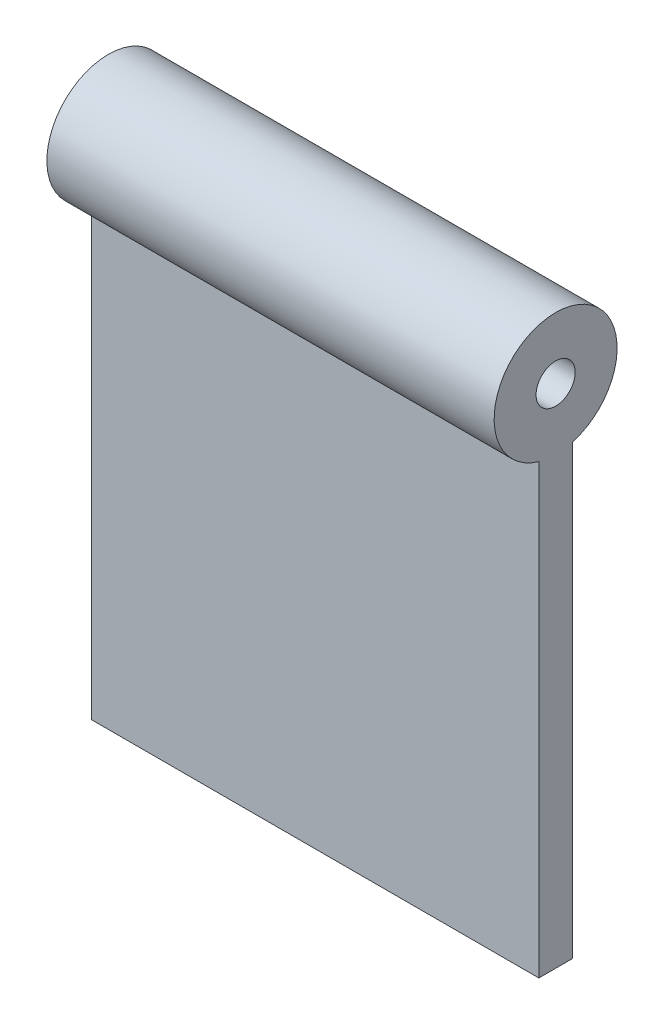
ISO-10303-21;
HEADER;
FILE_DESCRIPTION(('STEP AP214'),'2;1');
FILE_NAME('part.step','',(''),(''),'','','');
FILE_SCHEMA(('AUTOMOTIVE_DESIGN { 1 0 10303 214 1 1 1 1 }'));
ENDSEC;
DATA;
#1=APPLICATION_CONTEXT('core data for automotive mechanical design processes');
#2=APPLICATION_PROTOCOL_DEFINITION('international standard','automotive_design',2000,#1);
#3=PRODUCT_CONTEXT('',#1,'mechanical');
#4=PRODUCT('Part','Part','',(#3));
#5=PRODUCT_RELATED_PRODUCT_CATEGORY('part','',(#4));
#6=PRODUCT_DEFINITION_FORMATION('','',#4);
#7=PRODUCT_DEFINITION_CONTEXT('part definition',#1,'design');
#8=PRODUCT_DEFINITION('design','',#6,#7);
#9=PRODUCT_DEFINITION_SHAPE('','',#8);
#10=(LENGTH_UNIT() NAMED_UNIT(*) SI_UNIT(.MILLI.,.METRE.));
#11=(NAMED_UNIT(*) PLANE_ANGLE_UNIT() SI_UNIT($,.RADIAN.));
#12=(NAMED_UNIT(*) SI_UNIT($,.STERADIAN.) SOLID_ANGLE_UNIT());
#13=UNCERTAINTY_MEASURE_WITH_UNIT(LENGTH_MEASURE(1.E-05),#10,'distance_accuracy_value','');
#14=(GEOMETRIC_REPRESENTATION_CONTEXT(3) GLOBAL_UNCERTAINTY_ASSIGNED_CONTEXT((#13)) GLOBAL_UNIT_ASSIGNED_CONTEXT((#10,
#11,#12)) REPRESENTATION_CONTEXT('',''));
#15=CARTESIAN_POINT('',(0.,0.,0.));
#16=DIRECTION('',(0.,0.,1.));
#17=DIRECTION('',(1.,0.,0.));
#18=AXIS2_PLACEMENT_3D('',#15,#16,#17);
#19=CARTESIAN_POINT('',(8.,0.,0.));
#20=DIRECTION('',(1.,0.,0.));
#21=DIRECTION('',(0.,0.,-1.));
#22=AXIS2_PLACEMENT_3D('',#19,#20,#21);
#23=PLANE('',#22);
#24=CARTESIAN_POINT('',(8.,0.,0.));
#25=DIRECTION('',(1.,0.,0.));
#26=DIRECTION('',(0.,0.,-1.));
#27=AXIS2_PLACEMENT_3D('',#24,#25,#26);
#28=CIRCLE('',#27,1.1);
#29=CARTESIAN_POINT('',(8.,-1.05830052442584,-0.3));
#30=VERTEX_POINT('',#29);
#31=CARTESIAN_POINT('',(8.,-1.05830052442584,0.3));
#32=VERTEX_POINT('',#31);
#33=EDGE_CURVE('E87',#30,#32,#28,.T.);
#34=ORIENTED_EDGE('',*,*,#33,.T.);
#35=DIRECTION('',(0.,-1.,0.));
#36=VECTOR('',#35,1.);
#37=CARTESIAN_POINT('',(8.,-9.05830052442584,0.300000000000001));
#38=LINE('',#37,#36);
#39=CARTESIAN_POINT('',(8.,-9.05830052442584,0.300000000000001));
#40=VERTEX_POINT('',#39);
#41=EDGE_CURVE('E82',#32,#40,#38,.T.);
#42=ORIENTED_EDGE('',*,*,#41,.T.);
#43=DIRECTION('',(0.,0.,-1.));
#44=VECTOR('',#43,1.);
#45=CARTESIAN_POINT('',(8.,-9.05830052442584,-0.300000000000001));
#46=LINE('',#45,#44);
#47=CARTESIAN_POINT('',(8.,-9.05830052442584,-0.300000000000001));
#48=VERTEX_POINT('',#47);
#49=EDGE_CURVE('E85',#40,#48,#46,.T.);
#50=ORIENTED_EDGE('',*,*,#49,.T.);
#51=DIRECTION('',(0.,1.,0.));
#52=VECTOR('',#51,1.);
#53=CARTESIAN_POINT('',(8.,-1.05830052442584,-0.3));
#54=LINE('',#53,#52);
#55=EDGE_CURVE('E52',#48,#30,#54,.T.);
#56=ORIENTED_EDGE('',*,*,#55,.T.);
#57=EDGE_LOOP('',(#34,#42,#50,#56));
#58=FACE_BOUND('',#57,.T.);
#59=CARTESIAN_POINT('',(8.,0.,0.));
#60=DIRECTION('',(1.,0.,0.));
#61=DIRECTION('',(0.,0.,-1.));
#62=AXIS2_PLACEMENT_3D('',#59,#60,#61);
#63=CIRCLE('',#62,0.35);
#64=CARTESIAN_POINT('',(8.,0.,-0.35));
#65=VERTEX_POINT('',#64);
#66=EDGE_CURVE('E102',#65,#65,#63,.T.);
#67=ORIENTED_EDGE('',*,*,#66,.F.);
#68=EDGE_LOOP('',(#67));
#69=FACE_BOUND('',#68,.T.);
#70=ADVANCED_FACE('F35',(#58,#69),#23,.T.);
#71=CARTESIAN_POINT('',(0.,0.,0.));
#72=DIRECTION('',(1.,0.,0.));
#73=DIRECTION('',(0.,0.,-1.));
#74=AXIS2_PLACEMENT_3D('',#71,#72,#73);
#75=PLANE('',#74);
#76=CARTESIAN_POINT('',(0.,0.,0.));
#77=DIRECTION('',(1.,0.,0.));
#78=DIRECTION('',(0.,0.,-1.));
#79=AXIS2_PLACEMENT_3D('',#76,#77,#78);
#80=CIRCLE('',#79,1.1);
#81=CARTESIAN_POINT('',(0.,-1.05830052442584,-0.3));
#82=VERTEX_POINT('',#81);
#83=CARTESIAN_POINT('',(0.,-1.05830052442584,0.3));
#84=VERTEX_POINT('',#83);
#85=EDGE_CURVE('E99',#82,#84,#80,.T.);
#86=ORIENTED_EDGE('',*,*,#85,.F.);
#87=DIRECTION('',(0.,1.,0.));
#88=VECTOR('',#87,1.);
#89=CARTESIAN_POINT('',(0.,-1.05830052442584,-0.3));
#90=LINE('',#89,#88);
#91=CARTESIAN_POINT('',(0.,-9.05830052442584,-0.300000000000001));
#92=VERTEX_POINT('',#91);
#93=EDGE_CURVE('E75',#92,#82,#90,.T.);
#94=ORIENTED_EDGE('',*,*,#93,.F.);
#95=DIRECTION('',(0.,0.,-1.));
#96=VECTOR('',#95,1.);
#97=CARTESIAN_POINT('',(0.,-9.05830052442584,-0.300000000000001));
#98=LINE('',#97,#96);
#99=CARTESIAN_POINT('',(0.,-9.05830052442584,0.300000000000001));
#100=VERTEX_POINT('',#99);
#101=EDGE_CURVE('E69',#100,#92,#98,.T.);
#102=ORIENTED_EDGE('',*,*,#101,.F.);
#103=DIRECTION('',(0.,-1.,0.));
#104=VECTOR('',#103,1.);
#105=CARTESIAN_POINT('',(0.,-9.05830052442584,0.300000000000001));
#106=LINE('',#105,#104);
#107=EDGE_CURVE('E91',#84,#100,#106,.T.);
#108=ORIENTED_EDGE('',*,*,#107,.F.);
#109=EDGE_LOOP('',(#86,#94,#102,#108));
#110=FACE_BOUND('',#109,.T.);
#111=CARTESIAN_POINT('',(0.,0.,0.));
#112=DIRECTION('',(1.,0.,0.));
#113=DIRECTION('',(0.,0.,-1.));
#114=AXIS2_PLACEMENT_3D('',#111,#112,#113);
#115=CIRCLE('',#114,0.35);
#116=CARTESIAN_POINT('',(0.,0.,-0.35));
#117=VERTEX_POINT('',#116);
#118=EDGE_CURVE('E114',#117,#117,#115,.T.);
#119=ORIENTED_EDGE('',*,*,#118,.T.);
#120=EDGE_LOOP('',(#119));
#121=FACE_BOUND('',#120,.T.);
#122=ADVANCED_FACE('F110',(#110,#121),#75,.F.);
#123=CARTESIAN_POINT('',(8.,0.,0.));
#124=DIRECTION('',(-1.,0.,0.));
#125=DIRECTION('',(0.,0.,1.));
#126=AXIS2_PLACEMENT_3D('',#123,#124,#125);
#127=CYLINDRICAL_SURFACE('',#126,1.1);
#128=ORIENTED_EDGE('',*,*,#85,.T.);
#129=DIRECTION('',(-1.,0.,0.));
#130=VECTOR('',#129,1.);
#131=CARTESIAN_POINT('',(8.,-1.05830052442584,0.3));
#132=LINE('',#131,#130);
#133=EDGE_CURVE('E11',#32,#84,#132,.T.);
#134=ORIENTED_EDGE('',*,*,#133,.F.);
#135=ORIENTED_EDGE('',*,*,#33,.F.);
#136=DIRECTION('',(-1.,0.,0.));
#137=VECTOR('',#136,1.);
#138=CARTESIAN_POINT('',(8.,-1.05830052442584,-0.3));
#139=LINE('',#138,#137);
#140=EDGE_CURVE('E95',#30,#82,#139,.T.);
#141=ORIENTED_EDGE('',*,*,#140,.T.);
#142=EDGE_LOOP('',(#128,#134,#135,#141));
#143=FACE_BOUND('',#142,.T.);
#144=ADVANCED_FACE('F37',(#143),#127,.T.);
#145=CARTESIAN_POINT('',(8.,-9.05830052442584,0.300000000000001));
#146=DIRECTION('',(0.,0.,-1.));
#147=DIRECTION('',(0.,1.,0.));
#148=AXIS2_PLACEMENT_3D('',#145,#146,#147);
#149=PLANE('',#148);
#150=ORIENTED_EDGE('',*,*,#107,.T.);
#151=DIRECTION('',(-1.,0.,0.));
#152=VECTOR('',#151,1.);
#153=CARTESIAN_POINT('',(8.,-9.05830052442584,0.300000000000001));
#154=LINE('',#153,#152);
#155=EDGE_CURVE('E44',#40,#100,#154,.T.);
#156=ORIENTED_EDGE('',*,*,#155,.F.);
#157=ORIENTED_EDGE('',*,*,#41,.F.);
#158=ORIENTED_EDGE('',*,*,#133,.T.);
#159=EDGE_LOOP('',(#150,#156,#157,#158));
#160=FACE_BOUND('',#159,.T.);
#161=ADVANCED_FACE('F90',(#160),#149,.F.);
#162=CARTESIAN_POINT('',(8.,-9.05830052442584,-0.300000000000001));
#163=DIRECTION('',(0.,1.,0.));
#164=DIRECTION('',(0.,0.,1.));
#165=AXIS2_PLACEMENT_3D('',#162,#163,#164);
#166=PLANE('',#165);
#167=ORIENTED_EDGE('',*,*,#101,.T.);
#168=DIRECTION('',(-1.,0.,0.));
#169=VECTOR('',#168,1.);
#170=CARTESIAN_POINT('',(8.,-9.05830052442584,-0.300000000000001));
#171=LINE('',#170,#169);
#172=EDGE_CURVE('E92',#48,#92,#171,.T.);
#173=ORIENTED_EDGE('',*,*,#172,.F.);
#174=ORIENTED_EDGE('',*,*,#49,.F.);
#175=ORIENTED_EDGE('',*,*,#155,.T.);
#176=EDGE_LOOP('',(#167,#173,#174,#175));
#177=FACE_BOUND('',#176,.T.);
#178=ADVANCED_FACE('F93',(#177),#166,.F.);
#179=CARTESIAN_POINT('',(8.,-1.05830052442584,-0.3));
#180=DIRECTION('',(0.,0.,1.));
#181=DIRECTION('',(0.,-1.,0.));
#182=AXIS2_PLACEMENT_3D('',#179,#180,#181);
#183=PLANE('',#182);
#184=ORIENTED_EDGE('',*,*,#93,.T.);
#185=ORIENTED_EDGE('',*,*,#140,.F.);
#186=ORIENTED_EDGE('',*,*,#55,.F.);
#187=ORIENTED_EDGE('',*,*,#172,.T.);
#188=EDGE_LOOP('',(#184,#185,#186,#187));
#189=FACE_BOUND('',#188,.T.);
#190=ADVANCED_FACE('F107',(#189),#183,.F.);
#191=CARTESIAN_POINT('',(8.,0.,0.));
#192=DIRECTION('',(-1.,0.,0.));
#193=DIRECTION('',(0.,0.,1.));
#194=AXIS2_PLACEMENT_3D('',#191,#192,#193);
#195=CYLINDRICAL_SURFACE('',#194,0.35);
#196=ORIENTED_EDGE('',*,*,#66,.T.);
#197=EDGE_LOOP('',(#196));
#198=FACE_BOUND('',#197,.T.);
#199=ORIENTED_EDGE('',*,*,#118,.F.);
#200=EDGE_LOOP('',(#199));
#201=FACE_BOUND('',#200,.T.);
#202=ADVANCED_FACE('F120',(#198,#201),#195,.F.);
#203=CLOSED_SHELL('',(#70,#122,#144,#161,#178,#190,#202));
#204=MANIFOLD_SOLID_BREP('B2',#203);
#205=ADVANCED_BREP_SHAPE_REPRESENTATION('',(#18,#204),#14);
#206=SHAPE_DEFINITION_REPRESENTATION(#9,#205);
ENDSEC;
END-ISO-10303-21;
